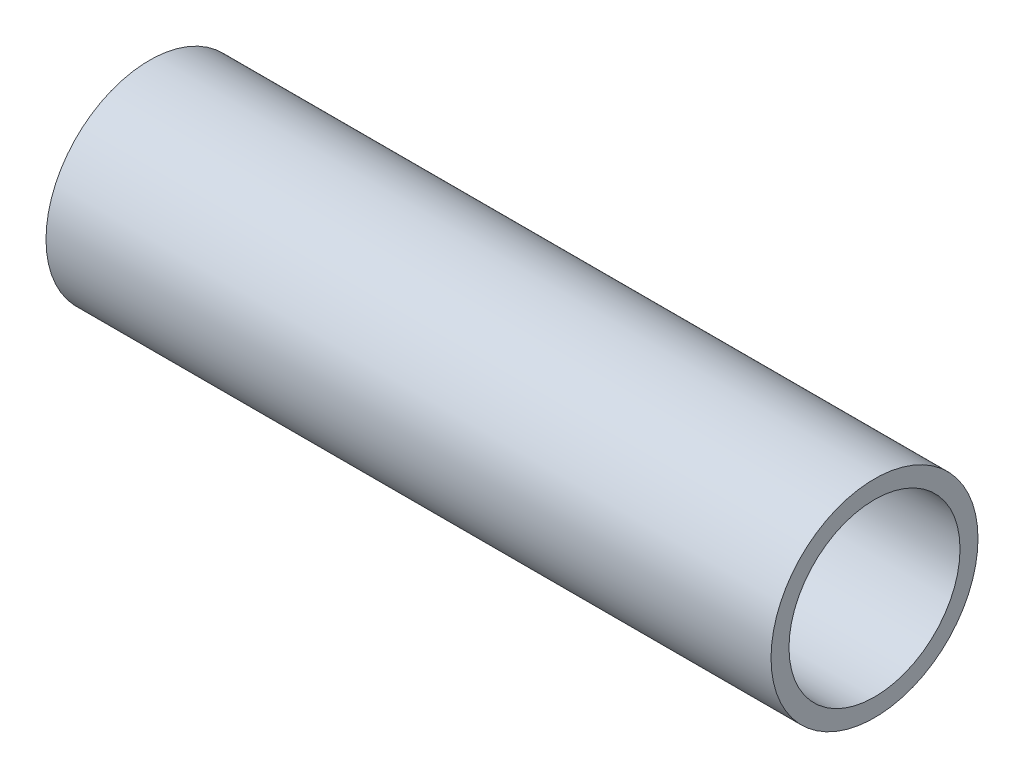
ISO-10303-21;
HEADER;
FILE_DESCRIPTION(('STEP AP214'),'2;1');
FILE_NAME('part.step','',(''),(''),'','','');
FILE_SCHEMA(('AUTOMOTIVE_DESIGN { 1 0 10303 214 1 1 1 1 }'));
ENDSEC;
DATA;
#1=APPLICATION_CONTEXT('core data for automotive mechanical design processes');
#2=APPLICATION_PROTOCOL_DEFINITION('international standard','automotive_design',2000,#1);
#3=PRODUCT_CONTEXT('',#1,'mechanical');
#4=PRODUCT('Part','Part','',(#3));
#5=PRODUCT_RELATED_PRODUCT_CATEGORY('part','',(#4));
#6=PRODUCT_DEFINITION_FORMATION('','',#4);
#7=PRODUCT_DEFINITION_CONTEXT('part definition',#1,'design');
#8=PRODUCT_DEFINITION('design','',#6,#7);
#9=PRODUCT_DEFINITION_SHAPE('','',#8);
#10=(LENGTH_UNIT() NAMED_UNIT(*) SI_UNIT(.MILLI.,.METRE.));
#11=(NAMED_UNIT(*) PLANE_ANGLE_UNIT() SI_UNIT($,.RADIAN.));
#12=(NAMED_UNIT(*) SI_UNIT($,.STERADIAN.) SOLID_ANGLE_UNIT());
#13=UNCERTAINTY_MEASURE_WITH_UNIT(LENGTH_MEASURE(1.E-05),#10,'distance_accuracy_value','');
#14=(GEOMETRIC_REPRESENTATION_CONTEXT(3) GLOBAL_UNCERTAINTY_ASSIGNED_CONTEXT((#13)) GLOBAL_UNIT_ASSIGNED_CONTEXT((#10,
#11,#12)) REPRESENTATION_CONTEXT('',''));
#15=CARTESIAN_POINT('',(0.,0.,0.));
#16=DIRECTION('',(0.,0.,1.));
#17=DIRECTION('',(1.,0.,0.));
#18=AXIS2_PLACEMENT_3D('',#15,#16,#17);
#19=CARTESIAN_POINT('',(117.,0.,0.));
#20=DIRECTION('',(1.,0.,0.));
#21=DIRECTION('',(0.,0.,-1.));
#22=AXIS2_PLACEMENT_3D('',#19,#20,#21);
#23=PLANE('',#22);
#24=CARTESIAN_POINT('',(117.,0.,0.));
#25=DIRECTION('',(1.,0.,0.));
#26=DIRECTION('',(0.,0.,-1.));
#27=AXIS2_PLACEMENT_3D('',#24,#25,#26);
#28=CIRCLE('',#27,16.7);
#29=CARTESIAN_POINT('',(117.,0.,-16.7));
#30=VERTEX_POINT('',#29);
#31=EDGE_CURVE('E10',#30,#30,#28,.T.);
#32=ORIENTED_EDGE('',*,*,#31,.T.);
#33=EDGE_LOOP('',(#32));
#34=FACE_BOUND('',#33,.T.);
#35=CARTESIAN_POINT('',(117.,0.,0.));
#36=DIRECTION('',(1.,0.,0.));
#37=DIRECTION('',(0.,0.,-1.));
#38=AXIS2_PLACEMENT_3D('',#35,#36,#37);
#39=CIRCLE('',#38,13.8);
#40=CARTESIAN_POINT('',(117.,0.,-13.8));
#41=VERTEX_POINT('',#40);
#42=EDGE_CURVE('E43',#41,#41,#39,.T.);
#43=ORIENTED_EDGE('',*,*,#42,.F.);
#44=EDGE_LOOP('',(#43));
#45=FACE_BOUND('',#44,.T.);
#46=ADVANCED_FACE('F32',(#34,#45),#23,.T.);
#47=CARTESIAN_POINT('',(0.,0.,0.));
#48=DIRECTION('',(1.,0.,0.));
#49=DIRECTION('',(0.,0.,-1.));
#50=AXIS2_PLACEMENT_3D('',#47,#48,#49);
#51=PLANE('',#50);
#52=CARTESIAN_POINT('',(0.,0.,0.));
#53=DIRECTION('',(1.,0.,0.));
#54=DIRECTION('',(0.,0.,-1.));
#55=AXIS2_PLACEMENT_3D('',#52,#53,#54);
#56=CIRCLE('',#55,16.7);
#57=CARTESIAN_POINT('',(0.,0.,-16.7));
#58=VERTEX_POINT('',#57);
#59=EDGE_CURVE('E36',#58,#58,#56,.T.);
#60=ORIENTED_EDGE('',*,*,#59,.F.);
#61=EDGE_LOOP('',(#60));
#62=FACE_BOUND('',#61,.T.);
#63=CARTESIAN_POINT('',(0.,0.,0.));
#64=DIRECTION('',(1.,0.,0.));
#65=DIRECTION('',(0.,0.,-1.));
#66=AXIS2_PLACEMENT_3D('',#63,#64,#65);
#67=CIRCLE('',#66,13.8);
#68=CARTESIAN_POINT('',(0.,0.,-13.8));
#69=VERTEX_POINT('',#68);
#70=EDGE_CURVE('E45',#69,#69,#67,.T.);
#71=ORIENTED_EDGE('',*,*,#70,.T.);
#72=EDGE_LOOP('',(#71));
#73=FACE_BOUND('',#72,.T.);
#74=ADVANCED_FACE('F55',(#62,#73),#51,.F.);
#75=CARTESIAN_POINT('',(117.,0.,0.));
#76=DIRECTION('',(-1.,0.,0.));
#77=DIRECTION('',(0.,0.,1.));
#78=AXIS2_PLACEMENT_3D('',#75,#76,#77);
#79=CYLINDRICAL_SURFACE('',#78,16.7);
#80=ORIENTED_EDGE('',*,*,#31,.F.);
#81=EDGE_LOOP('',(#80));
#82=FACE_BOUND('',#81,.T.);
#83=ORIENTED_EDGE('',*,*,#59,.T.);
#84=EDGE_LOOP('',(#83));
#85=FACE_BOUND('',#84,.T.);
#86=ADVANCED_FACE('F34',(#82,#85),#79,.T.);
#87=CARTESIAN_POINT('',(117.,0.,0.));
#88=DIRECTION('',(-1.,0.,0.));
#89=DIRECTION('',(0.,0.,1.));
#90=AXIS2_PLACEMENT_3D('',#87,#88,#89);
#91=CYLINDRICAL_SURFACE('',#90,13.8);
#92=ORIENTED_EDGE('',*,*,#42,.T.);
#93=EDGE_LOOP('',(#92));
#94=FACE_BOUND('',#93,.T.);
#95=ORIENTED_EDGE('',*,*,#70,.F.);
#96=EDGE_LOOP('',(#95));
#97=FACE_BOUND('',#96,.T.);
#98=ADVANCED_FACE('F51',(#94,#97),#91,.F.);
#99=CLOSED_SHELL('',(#46,#74,#86,#98));
#100=MANIFOLD_SOLID_BREP('B2',#99);
#101=ADVANCED_BREP_SHAPE_REPRESENTATION('',(#18,#100),#14);
#102=SHAPE_DEFINITION_REPRESENTATION(#9,#101);
ENDSEC;
END-ISO-10303-21;
